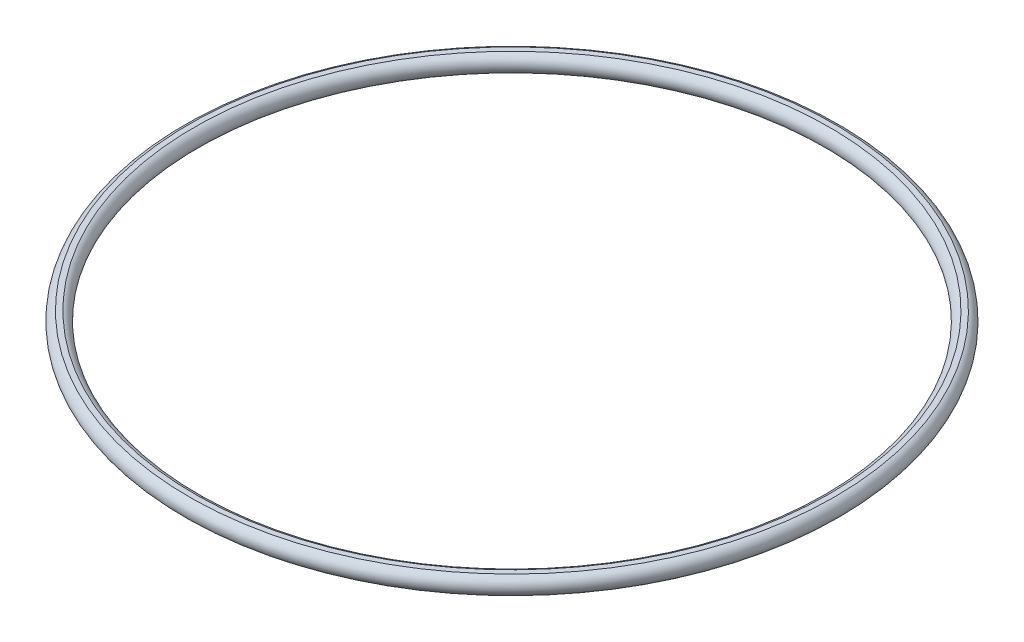
ISO-10303-21;
HEADER;
FILE_DESCRIPTION(('STEP AP214'),'2;1');
FILE_NAME('part.step','',(''),(''),'','','');
FILE_SCHEMA(('AUTOMOTIVE_DESIGN { 1 0 10303 214 1 1 1 1 }'));
ENDSEC;
DATA;
#1=APPLICATION_CONTEXT('core data for automotive mechanical design processes');
#2=APPLICATION_PROTOCOL_DEFINITION('international standard','automotive_design',2000,#1);
#3=PRODUCT_CONTEXT('',#1,'mechanical');
#4=PRODUCT('Part','Part','',(#3));
#5=PRODUCT_RELATED_PRODUCT_CATEGORY('part','',(#4));
#6=PRODUCT_DEFINITION_FORMATION('','',#4);
#7=PRODUCT_DEFINITION_CONTEXT('part definition',#1,'design');
#8=PRODUCT_DEFINITION('design','',#6,#7);
#9=PRODUCT_DEFINITION_SHAPE('','',#8);
#10=(LENGTH_UNIT() NAMED_UNIT(*) SI_UNIT(.MILLI.,.METRE.));
#11=(NAMED_UNIT(*) PLANE_ANGLE_UNIT() SI_UNIT($,.RADIAN.));
#12=(NAMED_UNIT(*) SI_UNIT($,.STERADIAN.) SOLID_ANGLE_UNIT());
#13=UNCERTAINTY_MEASURE_WITH_UNIT(LENGTH_MEASURE(1.E-05),#10,'distance_accuracy_value','');
#14=(GEOMETRIC_REPRESENTATION_CONTEXT(3) GLOBAL_UNCERTAINTY_ASSIGNED_CONTEXT((#13)) GLOBAL_UNIT_ASSIGNED_CONTEXT((#10,
#11,#12)) REPRESENTATION_CONTEXT('',''));
#15=CARTESIAN_POINT('',(0.,0.,0.));
#16=DIRECTION('',(0.,0.,1.));
#17=DIRECTION('',(1.,0.,0.));
#18=AXIS2_PLACEMENT_3D('',#15,#16,#17);
#19=CARTESIAN_POINT('',(42.5,-1.2,0.));
#20=DIRECTION('',(0.,-1.,0.));
#21=DIRECTION('',(0.,0.,-1.));
#22=AXIS2_PLACEMENT_3D('',#19,#20,#21);
#23=PLANE('',#22);
#24=CARTESIAN_POINT('',(42.5,-1.2,0.));
#25=DIRECTION('',(0.,-1.,0.));
#26=DIRECTION('',(-1.,0.,0.));
#27=AXIS2_PLACEMENT_3D('',#24,#25,#26);
#28=CIRCLE('',#27,42.15);
#29=CARTESIAN_POINT('',(84.65,-1.2,0.));
#30=VERTEX_POINT('',#29);
#31=EDGE_CURVE('E11',#30,#30,#28,.T.);
#32=ORIENTED_EDGE('',*,*,#31,.F.);
#33=EDGE_LOOP('',(#32));
#34=FACE_BOUND('',#33,.T.);
#35=CARTESIAN_POINT('',(42.5,-1.2,0.));
#36=DIRECTION('',(0.,1.,0.));
#37=DIRECTION('',(-1.,0.,0.));
#38=AXIS2_PLACEMENT_3D('',#35,#36,#37);
#39=CIRCLE('',#38,42.85);
#40=CARTESIAN_POINT('',(85.35,-1.2,0.));
#41=VERTEX_POINT('',#40);
#42=EDGE_CURVE('E62',#41,#41,#39,.T.);
#43=ORIENTED_EDGE('',*,*,#42,.F.);
#44=EDGE_LOOP('',(#43));
#45=FACE_BOUND('',#44,.T.);
#46=ADVANCED_FACE('F17',(#34,#45),#23,.T.);
#47=CARTESIAN_POINT('',(42.5,0.,0.));
#48=DIRECTION('',(0.,-1.,0.));
#49=DIRECTION('',(-1.,0.,0.));
#50=AXIS2_PLACEMENT_3D('',#47,#48,#49);
#51=TOROIDAL_SURFACE('',#50,42.5,1.25);
#52=CARTESIAN_POINT('',(42.5,1.2,0.));
#53=DIRECTION('',(0.,-1.,0.));
#54=DIRECTION('',(-1.,0.,0.));
#55=AXIS2_PLACEMENT_3D('',#52,#53,#54);
#56=CIRCLE('',#55,42.15);
#57=CARTESIAN_POINT('',(84.65,1.2,0.));
#58=VERTEX_POINT('',#57);
#59=EDGE_CURVE('E54',#58,#58,#56,.T.);
#60=ORIENTED_EDGE('',*,*,#59,.F.);
#61=CARTESIAN_POINT('',(85.,0.,0.));
#62=DIRECTION('',(0.,0.,1.));
#63=DIRECTION('',(1.,0.,0.));
#64=AXIS2_PLACEMENT_3D('',#61,#62,#63);
#65=CIRCLE('',#64,1.25);
#66=EDGE_CURVE('E27',#58,#30,#65,.T.);
#67=ORIENTED_EDGE('',*,*,#66,.T.);
#68=ORIENTED_EDGE('',*,*,#31,.T.);
#69=ORIENTED_EDGE('',*,*,#66,.F.);
#70=EDGE_LOOP('',(#60,#67,#68,#69));
#71=FACE_BOUND('',#70,.T.);
#72=ADVANCED_FACE('F73',(#71),#51,.T.);
#73=CARTESIAN_POINT('',(42.5,1.2,0.));
#74=DIRECTION('',(0.,-1.,0.));
#75=DIRECTION('',(0.,0.,-1.));
#76=AXIS2_PLACEMENT_3D('',#73,#74,#75);
#77=PLANE('',#76);
#78=ORIENTED_EDGE('',*,*,#59,.T.);
#79=EDGE_LOOP('',(#78));
#80=FACE_BOUND('',#79,.T.);
#81=CARTESIAN_POINT('',(42.5,1.2,0.));
#82=DIRECTION('',(0.,-1.,0.));
#83=DIRECTION('',(-1.,0.,0.));
#84=AXIS2_PLACEMENT_3D('',#81,#82,#83);
#85=CIRCLE('',#84,42.85);
#86=CARTESIAN_POINT('',(85.35,1.2,0.));
#87=VERTEX_POINT('',#86);
#88=EDGE_CURVE('E20',#87,#87,#85,.T.);
#89=ORIENTED_EDGE('',*,*,#88,.F.);
#90=EDGE_LOOP('',(#89));
#91=FACE_BOUND('',#90,.T.);
#92=ADVANCED_FACE('F75',(#80,#91),#77,.F.);
#93=CARTESIAN_POINT('',(42.5,0.,0.));
#94=DIRECTION('',(0.,-1.,0.));
#95=DIRECTION('',(-1.,0.,0.));
#96=AXIS2_PLACEMENT_3D('',#93,#94,#95);
#97=TOROIDAL_SURFACE('',#96,42.5,1.25);
#98=ORIENTED_EDGE('',*,*,#42,.T.);
#99=CARTESIAN_POINT('',(85.,0.,0.));
#100=DIRECTION('',(0.,0.,1.));
#101=DIRECTION('',(1.,0.,0.));
#102=AXIS2_PLACEMENT_3D('',#99,#100,#101);
#103=CIRCLE('',#102,1.25);
#104=EDGE_CURVE('E51',#41,#87,#103,.T.);
#105=ORIENTED_EDGE('',*,*,#104,.T.);
#106=ORIENTED_EDGE('',*,*,#88,.T.);
#107=ORIENTED_EDGE('',*,*,#104,.F.);
#108=EDGE_LOOP('',(#98,#105,#106,#107));
#109=FACE_BOUND('',#108,.T.);
#110=ADVANCED_FACE('F50',(#109),#97,.T.);
#111=CLOSED_SHELL('',(#46,#72,#92,#110));
#112=MANIFOLD_SOLID_BREP('B1',#111);
#113=ADVANCED_BREP_SHAPE_REPRESENTATION('',(#18,#112),#14);
#114=SHAPE_DEFINITION_REPRESENTATION(#9,#113);
ENDSEC;
END-ISO-10303-21;
